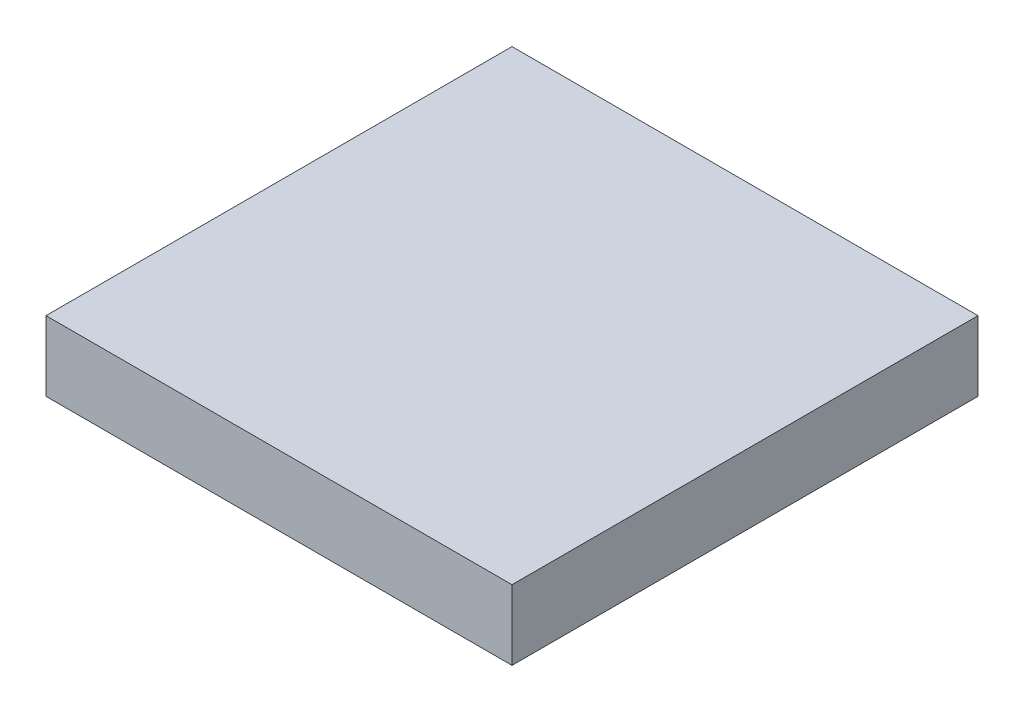
ISO-10303-21;
HEADER;
FILE_DESCRIPTION(('STEP AP214'),'2;1');
FILE_NAME('part.step','',(''),(''),'','','');
FILE_SCHEMA(('AUTOMOTIVE_DESIGN { 1 0 10303 214 1 1 1 1 }'));
ENDSEC;
DATA;
#1=APPLICATION_CONTEXT('core data for automotive mechanical design processes');
#2=APPLICATION_PROTOCOL_DEFINITION('international standard','automotive_design',2000,#1);
#3=PRODUCT_CONTEXT('',#1,'mechanical');
#4=PRODUCT('Part','Part','',(#3));
#5=PRODUCT_RELATED_PRODUCT_CATEGORY('part','',(#4));
#6=PRODUCT_DEFINITION_FORMATION('','',#4);
#7=PRODUCT_DEFINITION_CONTEXT('part definition',#1,'design');
#8=PRODUCT_DEFINITION('design','',#6,#7);
#9=PRODUCT_DEFINITION_SHAPE('','',#8);
#10=(LENGTH_UNIT() NAMED_UNIT(*) SI_UNIT(.MILLI.,.METRE.));
#11=(NAMED_UNIT(*) PLANE_ANGLE_UNIT() SI_UNIT($,.RADIAN.));
#12=(NAMED_UNIT(*) SI_UNIT($,.STERADIAN.) SOLID_ANGLE_UNIT());
#13=UNCERTAINTY_MEASURE_WITH_UNIT(LENGTH_MEASURE(1.E-05),#10,'distance_accuracy_value','');
#14=(GEOMETRIC_REPRESENTATION_CONTEXT(3) GLOBAL_UNCERTAINTY_ASSIGNED_CONTEXT((#13)) GLOBAL_UNIT_ASSIGNED_CONTEXT((#10,
#11,#12)) REPRESENTATION_CONTEXT('',''));
#15=CARTESIAN_POINT('',(0.,0.,0.));
#16=DIRECTION('',(0.,0.,1.));
#17=DIRECTION('',(1.,0.,0.));
#18=AXIS2_PLACEMENT_3D('',#15,#16,#17);
#19=CARTESIAN_POINT('',(-1.,0.,-1.));
#20=DIRECTION('',(-1.,0.,0.));
#21=DIRECTION('',(0.,0.,1.));
#22=AXIS2_PLACEMENT_3D('',#19,#20,#21);
#23=PLANE('',#22);
#24=DIRECTION('',(0.,0.,-1.));
#25=VECTOR('',#24,1.);
#26=CARTESIAN_POINT('',(-1.,0.,1.));
#27=LINE('',#26,#25);
#28=CARTESIAN_POINT('',(-1.,0.,1.));
#29=VERTEX_POINT('',#28);
#30=CARTESIAN_POINT('',(-1.,0.,-1.));
#31=VERTEX_POINT('',#30);
#32=EDGE_CURVE('E84',#29,#31,#27,.T.);
#33=ORIENTED_EDGE('',*,*,#32,.F.);
#34=DIRECTION('',(0.,1.,0.));
#35=VECTOR('',#34,1.);
#36=CARTESIAN_POINT('',(-1.,0.,1.));
#37=LINE('',#36,#35);
#38=CARTESIAN_POINT('',(-1.,0.3,1.));
#39=VERTEX_POINT('',#38);
#40=EDGE_CURVE('E73',#29,#39,#37,.T.);
#41=ORIENTED_EDGE('',*,*,#40,.T.);
#42=DIRECTION('',(0.,0.,1.));
#43=VECTOR('',#42,1.);
#44=CARTESIAN_POINT('',(-1.,0.3,1.));
#45=LINE('',#44,#43);
#46=CARTESIAN_POINT('',(-1.,0.3,-1.));
#47=VERTEX_POINT('',#46);
#48=EDGE_CURVE('E113',#47,#39,#45,.T.);
#49=ORIENTED_EDGE('',*,*,#48,.F.);
#50=DIRECTION('',(0.,1.,0.));
#51=VECTOR('',#50,1.);
#52=CARTESIAN_POINT('',(-1.,0.,-1.));
#53=LINE('',#52,#51);
#54=EDGE_CURVE('E11',#31,#47,#53,.T.);
#55=ORIENTED_EDGE('',*,*,#54,.F.);
#56=EDGE_LOOP('',(#33,#41,#49,#55));
#57=FACE_BOUND('',#56,.T.);
#58=ADVANCED_FACE('F17',(#57),#23,.T.);
#59=CARTESIAN_POINT('',(1.,0.,-1.));
#60=DIRECTION('',(0.,0.,-1.));
#61=DIRECTION('',(0.,-1.,0.));
#62=AXIS2_PLACEMENT_3D('',#59,#60,#61);
#63=PLANE('',#62);
#64=DIRECTION('',(1.,0.,0.));
#65=VECTOR('',#64,1.);
#66=CARTESIAN_POINT('',(-1.,0.,-1.));
#67=LINE('',#66,#65);
#68=CARTESIAN_POINT('',(1.,0.,-1.));
#69=VERTEX_POINT('',#68);
#70=EDGE_CURVE('E88',#31,#69,#67,.T.);
#71=ORIENTED_EDGE('',*,*,#70,.F.);
#72=ORIENTED_EDGE('',*,*,#54,.T.);
#73=DIRECTION('',(-1.,0.,0.));
#74=VECTOR('',#73,1.);
#75=CARTESIAN_POINT('',(-1.,0.3,-1.));
#76=LINE('',#75,#74);
#77=CARTESIAN_POINT('',(1.,0.3,-1.));
#78=VERTEX_POINT('',#77);
#79=EDGE_CURVE('E109',#78,#47,#76,.T.);
#80=ORIENTED_EDGE('',*,*,#79,.F.);
#81=DIRECTION('',(0.,1.,0.));
#82=VECTOR('',#81,1.);
#83=CARTESIAN_POINT('',(1.,0.,-1.));
#84=LINE('',#83,#82);
#85=EDGE_CURVE('E26',#69,#78,#84,.T.);
#86=ORIENTED_EDGE('',*,*,#85,.F.);
#87=EDGE_LOOP('',(#71,#72,#80,#86));
#88=FACE_BOUND('',#87,.T.);
#89=ADVANCED_FACE('F125',(#88),#63,.T.);
#90=CARTESIAN_POINT('',(1.,0.,1.));
#91=DIRECTION('',(1.,0.,0.));
#92=DIRECTION('',(0.,1.,0.));
#93=AXIS2_PLACEMENT_3D('',#90,#91,#92);
#94=PLANE('',#93);
#95=DIRECTION('',(0.,0.,1.));
#96=VECTOR('',#95,1.);
#97=CARTESIAN_POINT('',(1.,0.,-1.));
#98=LINE('',#97,#96);
#99=CARTESIAN_POINT('',(1.,0.,1.));
#100=VERTEX_POINT('',#99);
#101=EDGE_CURVE('E91',#69,#100,#98,.T.);
#102=ORIENTED_EDGE('',*,*,#101,.F.);
#103=ORIENTED_EDGE('',*,*,#85,.T.);
#104=DIRECTION('',(0.,0.,-1.));
#105=VECTOR('',#104,1.);
#106=CARTESIAN_POINT('',(1.,0.3,-1.));
#107=LINE('',#106,#105);
#108=CARTESIAN_POINT('',(1.,0.3,1.));
#109=VERTEX_POINT('',#108);
#110=EDGE_CURVE('E103',#109,#78,#107,.T.);
#111=ORIENTED_EDGE('',*,*,#110,.F.);
#112=DIRECTION('',(0.,1.,0.));
#113=VECTOR('',#112,1.);
#114=CARTESIAN_POINT('',(1.,0.,1.));
#115=LINE('',#114,#113);
#116=EDGE_CURVE('E81',#100,#109,#115,.T.);
#117=ORIENTED_EDGE('',*,*,#116,.F.);
#118=EDGE_LOOP('',(#102,#103,#111,#117));
#119=FACE_BOUND('',#118,.T.);
#120=ADVANCED_FACE('F119',(#119),#94,.T.);
#121=CARTESIAN_POINT('',(-1.,0.,1.));
#122=DIRECTION('',(0.,0.,1.));
#123=DIRECTION('',(1.,0.,0.));
#124=AXIS2_PLACEMENT_3D('',#121,#122,#123);
#125=PLANE('',#124);
#126=DIRECTION('',(-1.,0.,0.));
#127=VECTOR('',#126,1.);
#128=CARTESIAN_POINT('',(1.,0.,1.));
#129=LINE('',#128,#127);
#130=EDGE_CURVE('E76',#100,#29,#129,.T.);
#131=ORIENTED_EDGE('',*,*,#130,.F.);
#132=ORIENTED_EDGE('',*,*,#116,.T.);
#133=DIRECTION('',(1.,0.,0.));
#134=VECTOR('',#133,1.);
#135=CARTESIAN_POINT('',(1.,0.3,1.));
#136=LINE('',#135,#134);
#137=EDGE_CURVE('E78',#39,#109,#136,.T.);
#138=ORIENTED_EDGE('',*,*,#137,.F.);
#139=ORIENTED_EDGE('',*,*,#40,.F.);
#140=EDGE_LOOP('',(#131,#132,#138,#139));
#141=FACE_BOUND('',#140,.T.);
#142=ADVANCED_FACE('F74',(#141),#125,.T.);
#143=CARTESIAN_POINT('',(0.,0.3,0.));
#144=DIRECTION('',(0.,1.,0.));
#145=DIRECTION('',(1.,0.,0.));
#146=AXIS2_PLACEMENT_3D('',#143,#144,#145);
#147=PLANE('',#146);
#148=ORIENTED_EDGE('',*,*,#137,.T.);
#149=ORIENTED_EDGE('',*,*,#110,.T.);
#150=ORIENTED_EDGE('',*,*,#79,.T.);
#151=ORIENTED_EDGE('',*,*,#48,.T.);
#152=EDGE_LOOP('',(#148,#149,#150,#151));
#153=FACE_BOUND('',#152,.T.);
#154=ADVANCED_FACE('F121',(#153),#147,.T.);
#155=CARTESIAN_POINT('',(0.,0.,0.));
#156=DIRECTION('',(0.,1.,0.));
#157=DIRECTION('',(1.,0.,0.));
#158=AXIS2_PLACEMENT_3D('',#155,#156,#157);
#159=PLANE('',#158);
#160=ORIENTED_EDGE('',*,*,#130,.T.);
#161=ORIENTED_EDGE('',*,*,#32,.T.);
#162=ORIENTED_EDGE('',*,*,#70,.T.);
#163=ORIENTED_EDGE('',*,*,#101,.T.);
#164=EDGE_LOOP('',(#160,#161,#162,#163));
#165=FACE_BOUND('',#164,.T.);
#166=ADVANCED_FACE('F19',(#165),#159,.F.);
#167=CLOSED_SHELL('',(#58,#89,#120,#142,#154,#166));
#168=MANIFOLD_SOLID_BREP('B1',#167);
#169=ADVANCED_BREP_SHAPE_REPRESENTATION('',(#18,#168),#14);
#170=SHAPE_DEFINITION_REPRESENTATION(#9,#169);
ENDSEC;
END-ISO-10303-21;
